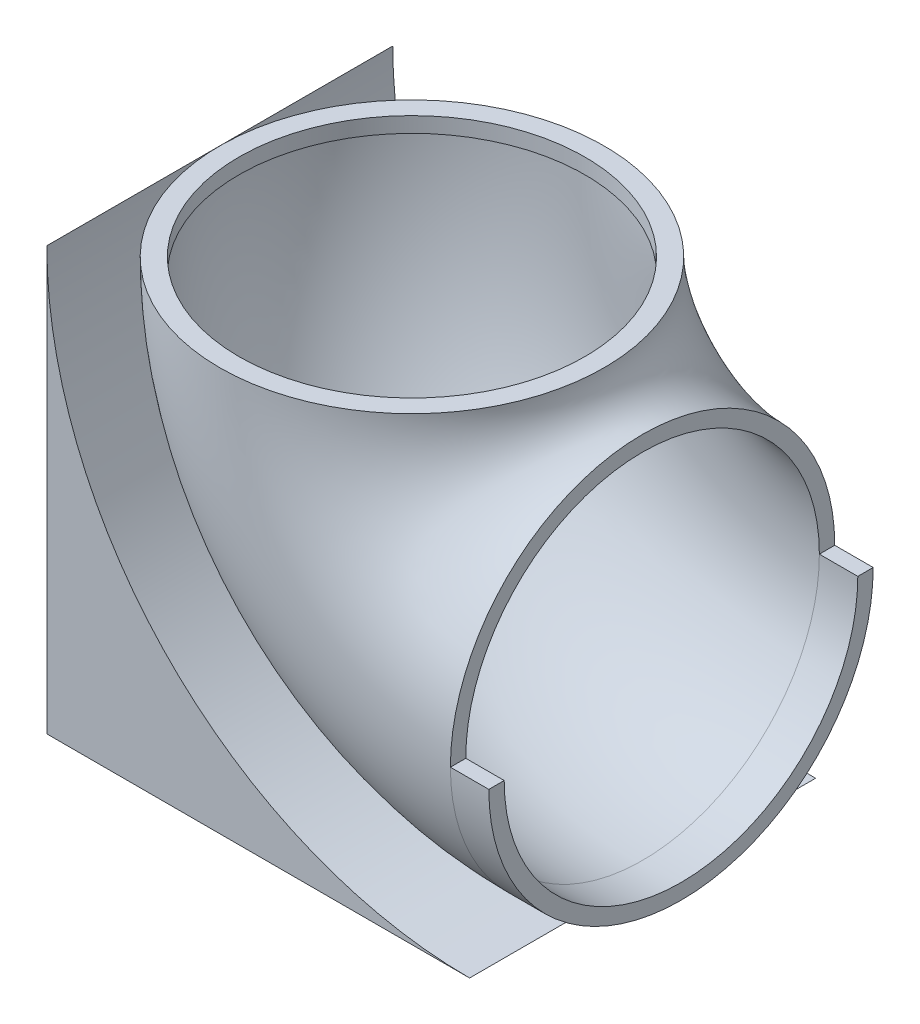
ISO-10303-21;
HEADER;
FILE_DESCRIPTION(('STEP AP214'),'2;1');
FILE_NAME('part.step','',(''),(''),'','','');
FILE_SCHEMA(('AUTOMOTIVE_DESIGN { 1 0 10303 214 1 1 1 1 }'));
ENDSEC;
DATA;
#1=APPLICATION_CONTEXT('core data for automotive mechanical design processes');
#2=APPLICATION_PROTOCOL_DEFINITION('international standard','automotive_design',2000,#1);
#3=PRODUCT_CONTEXT('',#1,'mechanical');
#4=PRODUCT('Part','Part','',(#3));
#5=PRODUCT_RELATED_PRODUCT_CATEGORY('part','',(#4));
#6=PRODUCT_DEFINITION_FORMATION('','',#4);
#7=PRODUCT_DEFINITION_CONTEXT('part definition',#1,'design');
#8=PRODUCT_DEFINITION('design','',#6,#7);
#9=PRODUCT_DEFINITION_SHAPE('','',#8);
#10=(LENGTH_UNIT() NAMED_UNIT(*) SI_UNIT(.MILLI.,.METRE.));
#11=(NAMED_UNIT(*) PLANE_ANGLE_UNIT() SI_UNIT($,.RADIAN.));
#12=(NAMED_UNIT(*) SI_UNIT($,.STERADIAN.) SOLID_ANGLE_UNIT());
#13=UNCERTAINTY_MEASURE_WITH_UNIT(LENGTH_MEASURE(1.E-05),#10,'distance_accuracy_value','');
#14=(GEOMETRIC_REPRESENTATION_CONTEXT(3) GLOBAL_UNCERTAINTY_ASSIGNED_CONTEXT((#13)) GLOBAL_UNIT_ASSIGNED_CONTEXT((#10,
#11,#12)) REPRESENTATION_CONTEXT('',''));
#15=CARTESIAN_POINT('',(0.,0.,0.));
#16=DIRECTION('',(0.,0.,1.));
#17=DIRECTION('',(1.,0.,0.));
#18=AXIS2_PLACEMENT_3D('',#15,#16,#17);
#19=CARTESIAN_POINT('',(0.,0.,22.5));
#20=DIRECTION('',(0.,0.,-1.));
#21=DIRECTION('',(-1.,0.,0.));
#22=AXIS2_PLACEMENT_3D('',#19,#20,#21);
#23=PLANE('',#22);
#24=CARTESIAN_POINT('',(30.0000000000001,0.,22.5));
#25=DIRECTION('',(0.,0.,-1.));
#26=DIRECTION('',(-1.,0.,0.));
#27=AXIS2_PLACEMENT_3D('',#24,#25,#26);
#28=CIRCLE('',#27,55.0000000000001);
#29=CARTESIAN_POINT('',(30.0000000000002,-55.,22.5));
#30=VERTEX_POINT('',#29);
#31=CARTESIAN_POINT('',(-25.,0.,22.5));
#32=VERTEX_POINT('',#31);
#33=EDGE_CURVE('E112',#30,#32,#28,.T.);
#34=ORIENTED_EDGE('',*,*,#33,.T.);
#35=DIRECTION('',(0.,-1.,0.));
#36=VECTOR('',#35,1.);
#37=CARTESIAN_POINT('',(-25.,0.,22.5));
#38=LINE('',#37,#36);
#39=CARTESIAN_POINT('',(-25.,-55.,22.5));
#40=VERTEX_POINT('',#39);
#41=EDGE_CURVE('E117',#32,#40,#38,.T.);
#42=ORIENTED_EDGE('',*,*,#41,.T.);
#43=DIRECTION('',(-1.,0.,0.));
#44=VECTOR('',#43,1.);
#45=CARTESIAN_POINT('',(30.0000000000002,-55.,22.5));
#46=LINE('',#45,#44);
#47=EDGE_CURVE('E92',#30,#40,#46,.T.);
#48=ORIENTED_EDGE('',*,*,#47,.F.);
#49=EDGE_LOOP('',(#34,#42,#48));
#50=FACE_BOUND('',#49,.T.);
#51=ADVANCED_FACE('F82',(#50),#23,.F.);
#52=CARTESIAN_POINT('',(0.,0.,-22.5));
#53=DIRECTION('',(0.,0.,-1.));
#54=DIRECTION('',(-1.,0.,0.));
#55=AXIS2_PLACEMENT_3D('',#52,#53,#54);
#56=PLANE('',#55);
#57=CARTESIAN_POINT('',(30.0000000000001,0.,-22.5));
#58=DIRECTION('',(0.,0.,-1.));
#59=DIRECTION('',(-1.,0.,0.));
#60=AXIS2_PLACEMENT_3D('',#57,#58,#59);
#61=CIRCLE('',#60,55.0000000000001);
#62=CARTESIAN_POINT('',(30.0000000000002,-55.,-22.5));
#63=VERTEX_POINT('',#62);
#64=CARTESIAN_POINT('',(-25.,0.,-22.5));
#65=VERTEX_POINT('',#64);
#66=EDGE_CURVE('E129',#63,#65,#61,.T.);
#67=ORIENTED_EDGE('',*,*,#66,.F.);
#68=DIRECTION('',(-1.,0.,0.));
#69=VECTOR('',#68,1.);
#70=CARTESIAN_POINT('',(30.0000000000002,-55.,-22.5));
#71=LINE('',#70,#69);
#72=CARTESIAN_POINT('',(-25.,-55.,-22.5));
#73=VERTEX_POINT('',#72);
#74=EDGE_CURVE('E13',#63,#73,#71,.T.);
#75=ORIENTED_EDGE('',*,*,#74,.T.);
#76=DIRECTION('',(0.,-1.,0.));
#77=VECTOR('',#76,1.);
#78=CARTESIAN_POINT('',(-25.,0.,-22.5));
#79=LINE('',#78,#77);
#80=EDGE_CURVE('E148',#65,#73,#79,.T.);
#81=ORIENTED_EDGE('',*,*,#80,.F.);
#82=EDGE_LOOP('',(#67,#75,#81));
#83=FACE_BOUND('',#82,.T.);
#84=ADVANCED_FACE('F168',(#83),#56,.T.);
#85=CARTESIAN_POINT('',(30.0000000000001,0.,-22.5));
#86=DIRECTION('',(0.,0.,1.));
#87=DIRECTION('',(1.,0.,0.));
#88=AXIS2_PLACEMENT_3D('',#85,#86,#87);
#89=CYLINDRICAL_SURFACE('',#88,55.0000000000001);
#90=ORIENTED_EDGE('',*,*,#33,.F.);
#91=DIRECTION('',(0.,0.,1.));
#92=VECTOR('',#91,1.);
#93=CARTESIAN_POINT('',(30.0000000000002,-55.,-22.5));
#94=LINE('',#93,#92);
#95=EDGE_CURVE('E124',#63,#30,#94,.T.);
#96=ORIENTED_EDGE('',*,*,#95,.F.);
#97=ORIENTED_EDGE('',*,*,#66,.T.);
#98=DIRECTION('',(0.,0.,1.));
#99=VECTOR('',#98,1.);
#100=CARTESIAN_POINT('',(-25.,0.,-22.5));
#101=LINE('',#100,#99);
#102=EDGE_CURVE('E133',#65,#32,#101,.T.);
#103=ORIENTED_EDGE('',*,*,#102,.T.);
#104=EDGE_LOOP('',(#90,#96,#97,#103));
#105=FACE_BOUND('',#104,.T.);
#106=ADVANCED_FACE('F131',(#105),#89,.F.);
#107=CARTESIAN_POINT('',(-25.,0.,-22.5));
#108=DIRECTION('',(-1.,0.,0.));
#109=DIRECTION('',(0.,0.,1.));
#110=AXIS2_PLACEMENT_3D('',#107,#108,#109);
#111=PLANE('',#110);
#112=ORIENTED_EDGE('',*,*,#41,.F.);
#113=ORIENTED_EDGE('',*,*,#102,.F.);
#114=ORIENTED_EDGE('',*,*,#80,.T.);
#115=DIRECTION('',(0.,0.,1.));
#116=VECTOR('',#115,1.);
#117=CARTESIAN_POINT('',(-25.,-55.,-22.5));
#118=LINE('',#117,#116);
#119=EDGE_CURVE('E121',#73,#40,#118,.T.);
#120=ORIENTED_EDGE('',*,*,#119,.T.);
#121=EDGE_LOOP('',(#112,#113,#114,#120));
#122=FACE_BOUND('',#121,.T.);
#123=ADVANCED_FACE('F167',(#122),#111,.T.);
#124=CARTESIAN_POINT('',(30.0000000000002,-55.,-22.5));
#125=DIRECTION('',(0.,1.,0.));
#126=DIRECTION('',(0.,0.,1.));
#127=AXIS2_PLACEMENT_3D('',#124,#125,#126);
#128=PLANE('',#127);
#129=CARTESIAN_POINT('',(-10.,-55.,15.));
#130=DIRECTION('',(0.,-1.,0.));
#131=DIRECTION('',(0.,0.,-1.));
#132=AXIS2_PLACEMENT_3D('',#129,#130,#131);
#133=CIRCLE('',#132,4.);
#134=CARTESIAN_POINT('',(-10.,-55.,11.));
#135=VERTEX_POINT('',#134);
#136=EDGE_CURVE('E139',#135,#135,#133,.T.);
#137=ORIENTED_EDGE('',*,*,#136,.F.);
#138=EDGE_LOOP('',(#137));
#139=FACE_BOUND('',#138,.T.);
#140=CARTESIAN_POINT('',(-10.,-55.,-15.));
#141=DIRECTION('',(0.,-1.,0.));
#142=DIRECTION('',(0.,0.,-1.));
#143=AXIS2_PLACEMENT_3D('',#140,#141,#142);
#144=CIRCLE('',#143,4.);
#145=CARTESIAN_POINT('',(-10.,-55.,-19.));
#146=VERTEX_POINT('',#145);
#147=EDGE_CURVE('E206',#146,#146,#144,.T.);
#148=ORIENTED_EDGE('',*,*,#147,.F.);
#149=EDGE_LOOP('',(#148));
#150=FACE_BOUND('',#149,.T.);
#151=ORIENTED_EDGE('',*,*,#47,.T.);
#152=ORIENTED_EDGE('',*,*,#119,.F.);
#153=ORIENTED_EDGE('',*,*,#74,.F.);
#154=ORIENTED_EDGE('',*,*,#95,.T.);
#155=EDGE_LOOP('',(#151,#152,#153,#154));
#156=FACE_BOUND('',#155,.T.);
#157=ADVANCED_FACE('F125',(#139,#150,#156),#128,.F.);
#158=CARTESIAN_POINT('',(-10.,-49.,-15.));
#159=DIRECTION('',(0.,-1.,0.));
#160=DIRECTION('',(0.,0.,-1.));
#161=AXIS2_PLACEMENT_3D('',#158,#159,#160);
#162=CYLINDRICAL_SURFACE('',#161,4.);
#163=CARTESIAN_POINT('',(-10.,-49.,-15.));
#164=DIRECTION('',(0.,-1.,0.));
#165=DIRECTION('',(0.,0.,-1.));
#166=AXIS2_PLACEMENT_3D('',#163,#164,#165);
#167=CIRCLE('',#166,4.);
#168=CARTESIAN_POINT('',(-10.,-49.,-19.));
#169=VERTEX_POINT('',#168);
#170=EDGE_CURVE('E210',#169,#169,#167,.T.);
#171=ORIENTED_EDGE('',*,*,#170,.F.);
#172=EDGE_LOOP('',(#171));
#173=FACE_BOUND('',#172,.T.);
#174=ORIENTED_EDGE('',*,*,#147,.T.);
#175=EDGE_LOOP('',(#174));
#176=FACE_BOUND('',#175,.T.);
#177=ADVANCED_FACE('F175',(#173,#176),#162,.F.);
#178=CARTESIAN_POINT('',(-10.,-49.,-15.));
#179=DIRECTION('',(0.,-1.,0.));
#180=DIRECTION('',(0.,0.,-1.));
#181=AXIS2_PLACEMENT_3D('',#178,#179,#180);
#182=PLANE('',#181);
#183=ORIENTED_EDGE('',*,*,#170,.T.);
#184=EDGE_LOOP('',(#183));
#185=FACE_BOUND('',#184,.T.);
#186=ADVANCED_FACE('F183',(#185),#182,.T.);
#187=CARTESIAN_POINT('',(-10.,-49.,15.));
#188=DIRECTION('',(0.,-1.,0.));
#189=DIRECTION('',(0.,0.,-1.));
#190=AXIS2_PLACEMENT_3D('',#187,#188,#189);
#191=CYLINDRICAL_SURFACE('',#190,4.);
#192=CARTESIAN_POINT('',(-10.,-49.,15.));
#193=DIRECTION('',(0.,-1.,0.));
#194=DIRECTION('',(0.,0.,-1.));
#195=AXIS2_PLACEMENT_3D('',#192,#193,#194);
#196=CIRCLE('',#195,4.);
#197=CARTESIAN_POINT('',(-10.,-49.,11.));
#198=VERTEX_POINT('',#197);
#199=EDGE_CURVE('E135',#198,#198,#196,.T.);
#200=ORIENTED_EDGE('',*,*,#199,.F.);
#201=EDGE_LOOP('',(#200));
#202=FACE_BOUND('',#201,.T.);
#203=ORIENTED_EDGE('',*,*,#136,.T.);
#204=EDGE_LOOP('',(#203));
#205=FACE_BOUND('',#204,.T.);
#206=ADVANCED_FACE('F191',(#202,#205),#191,.F.);
#207=CARTESIAN_POINT('',(-10.,-49.,15.));
#208=DIRECTION('',(0.,-1.,0.));
#209=DIRECTION('',(0.,0.,-1.));
#210=AXIS2_PLACEMENT_3D('',#207,#208,#209);
#211=PLANE('',#210);
#212=ORIENTED_EDGE('',*,*,#199,.T.);
#213=EDGE_LOOP('',(#212));
#214=FACE_BOUND('',#213,.T.);
#215=ADVANCED_FACE('F196',(#214),#211,.T.);
#216=CLOSED_SHELL('',(#51,#84,#106,#123,#157,#177,#186,#206,#215));
#217=MANIFOLD_SOLID_BREP('B2',#216);
#218=CARTESIAN_POINT('',(0.,85.,0.));
#219=DIRECTION('',(0.,-1.,0.));
#220=DIRECTION('',(0.,0.,-1.));
#221=AXIS2_PLACEMENT_3D('',#218,#219,#220);
#222=CYLINDRICAL_SURFACE('',#221,22.5);
#223=CARTESIAN_POINT('',(0.,-2.,0.));
#224=DIRECTION('',(0.,1.,0.));
#225=DIRECTION('',(0.,0.,1.));
#226=AXIS2_PLACEMENT_3D('',#223,#224,#225);
#227=CIRCLE('',#226,22.5);
#228=CARTESIAN_POINT('',(0.,-2.,22.5));
#229=VERTEX_POINT('',#228);
#230=EDGE_CURVE('E353',#229,#229,#227,.T.);
#231=ORIENTED_EDGE('',*,*,#230,.F.);
#232=EDGE_LOOP('',(#231));
#233=FACE_BOUND('',#232,.T.);
#234=CARTESIAN_POINT('',(0.,0.,0.));
#235=DIRECTION('',(0.,1.,0.));
#236=DIRECTION('',(0.,0.,1.));
#237=AXIS2_PLACEMENT_3D('',#234,#235,#236);
#238=CIRCLE('',#237,22.5);
#239=CARTESIAN_POINT('',(0.,0.,22.5));
#240=VERTEX_POINT('',#239);
#241=EDGE_CURVE('E391',#240,#240,#238,.T.);
#242=ORIENTED_EDGE('',*,*,#241,.T.);
#243=EDGE_LOOP('',(#242));
#244=FACE_BOUND('',#243,.T.);
#245=ADVANCED_FACE('F271',(#233,#244),#222,.F.);
#246=CARTESIAN_POINT('',(30.,0.,0.));
#247=DIRECTION('',(0.,0.,-1.));
#248=DIRECTION('',(-1.,0.,0.));
#249=AXIS2_PLACEMENT_3D('',#246,#247,#248);
#250=TOROIDAL_SURFACE('',#249,30.,25.);
#251=CARTESIAN_POINT('',(30.0000000000001,-30.,0.));
#252=DIRECTION('',(1.,0.,0.));
#253=DIRECTION('',(0.,1.,0.));
#254=AXIS2_PLACEMENT_3D('',#251,#252,#253);
#255=CIRCLE('',#254,25.);
#256=CARTESIAN_POINT('',(30.0000000000001,-30.,25.));
#257=VERTEX_POINT('',#256);
#258=CARTESIAN_POINT('',(30.0000000000001,-30.,-25.));
#259=VERTEX_POINT('',#258);
#260=EDGE_CURVE('E329',#257,#259,#255,.T.);
#261=ORIENTED_EDGE('',*,*,#260,.F.);
#262=CARTESIAN_POINT('',(30.0000000000001,-30.,0.));
#263=DIRECTION('',(-1.,0.,0.));
#264=DIRECTION('',(0.,-1.,0.));
#265=AXIS2_PLACEMENT_3D('',#262,#263,#264);
#266=CIRCLE('',#265,25.);
#267=EDGE_CURVE('E307',#257,#259,#266,.T.);
#268=ORIENTED_EDGE('',*,*,#267,.T.);
#269=EDGE_LOOP('',(#261,#268));
#270=FACE_BOUND('',#269,.T.);
#271=CARTESIAN_POINT('',(0.,0.,0.));
#272=DIRECTION('',(0.,1.,0.));
#273=DIRECTION('',(0.,0.,1.));
#274=AXIS2_PLACEMENT_3D('',#271,#272,#273);
#275=CIRCLE('',#274,25.);
#276=CARTESIAN_POINT('',(0.,0.,25.));
#277=VERTEX_POINT('',#276);
#278=EDGE_CURVE('E392',#277,#277,#275,.F.);
#279=ORIENTED_EDGE('',*,*,#278,.T.);
#280=EDGE_LOOP('',(#279));
#281=FACE_BOUND('',#280,.T.);
#282=ADVANCED_FACE('F333',(#270,#281),#250,.T.);
#283=CARTESIAN_POINT('',(35.0000000000001,-30.,0.));
#284=DIRECTION('',(-1.,0.,0.));
#285=DIRECTION('',(0.,-1.,0.));
#286=AXIS2_PLACEMENT_3D('',#283,#284,#285);
#287=CYLINDRICAL_SURFACE('',#286,25.);
#288=CARTESIAN_POINT('',(35.0000000000001,-30.,0.));
#289=DIRECTION('',(1.,0.,0.));
#290=DIRECTION('',(0.,1.,0.));
#291=AXIS2_PLACEMENT_3D('',#288,#289,#290);
#292=CIRCLE('',#291,25.);
#293=CARTESIAN_POINT('',(35.0000000000001,-30.,25.));
#294=VERTEX_POINT('',#293);
#295=CARTESIAN_POINT('',(35.0000000000001,-30.,-25.));
#296=VERTEX_POINT('',#295);
#297=EDGE_CURVE('E331',#294,#296,#292,.T.);
#298=ORIENTED_EDGE('',*,*,#297,.F.);
#299=DIRECTION('',(1.,0.,0.));
#300=VECTOR('',#299,1.);
#301=CARTESIAN_POINT('',(30.0000000000001,-30.,25.));
#302=LINE('',#301,#300);
#303=EDGE_CURVE('E320',#257,#294,#302,.T.);
#304=ORIENTED_EDGE('',*,*,#303,.F.);
#305=ORIENTED_EDGE('',*,*,#260,.T.);
#306=DIRECTION('',(1.,0.,0.));
#307=VECTOR('',#306,1.);
#308=CARTESIAN_POINT('',(30.0000000000001,-30.,-25.));
#309=LINE('',#308,#307);
#310=EDGE_CURVE('E315',#259,#296,#309,.T.);
#311=ORIENTED_EDGE('',*,*,#310,.T.);
#312=EDGE_LOOP('',(#298,#304,#305,#311));
#313=FACE_BOUND('',#312,.T.);
#314=ADVANCED_FACE('F327',(#313),#287,.T.);
#315=CARTESIAN_POINT('',(35.0000000000001,-30.,0.));
#316=DIRECTION('',(1.,0.,0.));
#317=DIRECTION('',(0.,1.,0.));
#318=AXIS2_PLACEMENT_3D('',#315,#316,#317);
#319=PLANE('',#318);
#320=DIRECTION('',(0.,0.,-1.));
#321=VECTOR('',#320,1.);
#322=CARTESIAN_POINT('',(35.0000000000001,-30.,25.));
#323=LINE('',#322,#321);
#324=CARTESIAN_POINT('',(35.0000000000001,-30.,23.));
#325=VERTEX_POINT('',#324);
#326=EDGE_CURVE('E352',#294,#325,#323,.T.);
#327=ORIENTED_EDGE('',*,*,#326,.F.);
#328=ORIENTED_EDGE('',*,*,#297,.T.);
#329=CARTESIAN_POINT('',(35.0000000000001,-30.,-23.));
#330=VERTEX_POINT('',#329);
#331=EDGE_CURVE('E345',#330,#296,#323,.T.);
#332=ORIENTED_EDGE('',*,*,#331,.F.);
#333=CARTESIAN_POINT('',(35.0000000000001,-30.,0.));
#334=DIRECTION('',(1.,0.,0.));
#335=DIRECTION('',(0.,1.,0.));
#336=AXIS2_PLACEMENT_3D('',#333,#334,#335);
#337=CIRCLE('',#336,23.);
#338=EDGE_CURVE('E339',#325,#330,#337,.T.);
#339=ORIENTED_EDGE('',*,*,#338,.F.);
#340=EDGE_LOOP('',(#327,#328,#332,#339));
#341=FACE_BOUND('',#340,.T.);
#342=ADVANCED_FACE('F351',(#341),#319,.T.);
#343=CARTESIAN_POINT('',(30.,0.,0.));
#344=DIRECTION('',(0.,0.,-1.));
#345=DIRECTION('',(-1.,0.,0.));
#346=AXIS2_PLACEMENT_3D('',#343,#344,#345);
#347=TOROIDAL_SURFACE('',#346,30.,23.);
#348=CARTESIAN_POINT('',(30.0000000000001,-30.,0.));
#349=DIRECTION('',(-1.,0.,0.));
#350=DIRECTION('',(0.,-1.,0.));
#351=AXIS2_PLACEMENT_3D('',#348,#349,#350);
#352=CIRCLE('',#351,23.);
#353=CARTESIAN_POINT('',(30.0000000000001,-30.,-23.));
#354=VERTEX_POINT('',#353);
#355=CARTESIAN_POINT('',(30.0000000000001,-30.,23.));
#356=VERTEX_POINT('',#355);
#357=EDGE_CURVE('E289',#354,#356,#352,.F.);
#358=ORIENTED_EDGE('',*,*,#357,.T.);
#359=EDGE_CURVE('E314',#356,#354,#352,.F.);
#360=ORIENTED_EDGE('',*,*,#359,.T.);
#361=EDGE_LOOP('',(#358,#360));
#362=FACE_BOUND('',#361,.T.);
#363=CARTESIAN_POINT('',(-16.1521800609827,-2.,-16.3311344858411));
#364=CARTESIAN_POINT('',(-15.6926575254816,-2.,-16.7864193980092));
#365=CARTESIAN_POINT('',(-15.213968669036,-2.,-17.2222546662401));
#366=CARTESIAN_POINT('',(-14.2214193138179,-2.,-18.0521918617121));
#367=CARTESIAN_POINT('',(-13.7075494564307,-2.,-18.4462826127835));
#368=CARTESIAN_POINT('',(-12.6478514648188,-2.,-19.1901855512612));
#369=CARTESIAN_POINT('',(-12.1019881106165,-2.,-19.5399475477929));
#370=CARTESIAN_POINT('',(-10.9827539200928,-2.,-20.1921863736468));
#371=CARTESIAN_POINT('',(-10.4093849401818,-2.,-20.4946663882742));
#372=CARTESIAN_POINT('',(-9.23949888869036,-2.,-21.0500886829596));
#373=CARTESIAN_POINT('',(-8.64299388201044,-2.,-21.3030563772269));
#374=CARTESIAN_POINT('',(-7.43079481547017,-2.,-21.7578764219807));
#375=CARTESIAN_POINT('',(-6.81510045381304,-2.,-21.959727968092));
#376=CARTESIAN_POINT('',(-5.56907365480272,-2.,-22.310856956331));
#377=CARTESIAN_POINT('',(-4.93874509498806,-2.,-22.4601481593653));
#378=CARTESIAN_POINT('',(-3.6677703630087,-2.,-22.7052020603749));
#379=CARTESIAN_POINT('',(-3.02712422184022,-2.,-22.80096491913));
#380=CARTESIAN_POINT('',(-1.73923523342294,-2.,-22.9384078396291));
#381=CARTESIAN_POINT('',(-1.09198505176568,-2.,-22.9800191722588));
#382=CARTESIAN_POINT('',(0.203721546881954,-2.,-23.0086816011404));
#383=CARTESIAN_POINT('',(0.852177965436526,-2.,-22.9957326265915));
#384=CARTESIAN_POINT('',(2.14574403765465,-2.,-22.9154127847956));
#385=CARTESIAN_POINT('',(2.79085351614781,-2.,-22.8480390974455));
#386=CARTESIAN_POINT('',(4.07314309619693,-2.,-22.6593984639075));
#387=CARTESIAN_POINT('',(4.71032318272901,-2.,-22.5381314156235));
#388=CARTESIAN_POINT('',(5.9740743629958,-2.,-22.2422012808867));
#389=CARTESIAN_POINT('',(6.6006100921216,-2.,-22.0673871728954));
#390=CARTESIAN_POINT('',(7.83679631730266,-2.,-21.6657898134567));
#391=CARTESIAN_POINT('',(8.44644679249724,-2.,-21.4390064978077));
#392=CARTESIAN_POINT('',(9.64458488843265,-2.,-20.9351534558422));
#393=CARTESIAN_POINT('',(10.2330729166768,-2.,-20.6580846984422));
#394=CARTESIAN_POINT('',(11.3848067532069,-2.,-20.0556891263433));
#395=CARTESIAN_POINT('',(11.9480524710712,-2.,-19.7303621387943));
#396=CARTESIAN_POINT('',(13.0481935102415,-2.,-19.0320471424553));
#397=CARTESIAN_POINT('',(13.5849408057043,-2.,-18.6588259223683));
#398=CARTESIAN_POINT('',(14.6252851588449,-2.,-17.8687383319873));
#399=CARTESIAN_POINT('',(15.1288821020005,-2.,-17.4518718109278));
#400=CARTESIAN_POINT('',(16.0995165014533,-2.,-16.577434194432));
#401=CARTESIAN_POINT('',(16.5665495667199,-2.,-16.1198582241686));
#402=CARTESIAN_POINT('',(17.4607594053644,-2.,-15.1673202270641));
#403=CARTESIAN_POINT('',(17.8879359468592,-2.,-14.6723579827418));
#404=CARTESIAN_POINT('',(18.7023863145778,-2.,-13.6448096288823));
#405=CARTESIAN_POINT('',(19.0893573882524,-2.,-13.1119827340714));
#406=CARTESIAN_POINT('',(19.6350393901427,-2.,-12.2899102491123));
#407=CARTESIAN_POINT('',(19.8111453749308,-2.,-12.012066601675));
#408=CARTESIAN_POINT('',(20.1515277307385,-2.,-11.4491204648222));
#409=CARTESIAN_POINT('',(20.3158008923244,-2.,-11.1640160342242));
#410=CARTESIAN_POINT('',(20.7902696333907,-2.,-10.2987141520804));
#411=CARTESIAN_POINT('',(21.0822125995843,-2.,-9.70838029140693));
#412=CARTESIAN_POINT('',(21.6147716228901,-2.,-8.50499702131085));
#413=CARTESIAN_POINT('',(21.855389172049,-2.,-7.89194827282576));
#414=CARTESIAN_POINT('',(22.175655118788,-2.,-6.95983997765273));
#415=CARTESIAN_POINT('',(22.2754950941204,-2.,-6.64760221958503));
#416=CARTESIAN_POINT('',(22.4615752123163,-2.,-6.01918966454013));
#417=CARTESIAN_POINT('',(22.547818830936,-2.,-5.70301589613211));
#418=CARTESIAN_POINT('',(22.7858033981648,-2.,-4.74925681688985));
#419=CARTESIAN_POINT('',(22.916822930735,-2.,-4.10636145040781));
#420=CARTESIAN_POINT('',(23.1216581394896,-2.,-2.8119308154001));
#421=CARTESIAN_POINT('',(23.1955031162419,-2.,-2.16040014661843));
#422=CARTESIAN_POINT('',(23.2849916995733,-2.,-0.85334090478862));
#423=CARTESIAN_POINT('',(23.3006378093596,-2.,-0.197812504902748));
#424=CARTESIAN_POINT('',(23.274021388634,-2.,1.08562440319145));
#425=CARTESIAN_POINT('',(23.2340655218374,-2.,1.71358208706634));
#426=CARTESIAN_POINT('',(23.1009202111351,-2.,2.96379224834695));
#427=CARTESIAN_POINT('',(23.0077316249073,-2.,3.58604481750854));
#428=CARTESIAN_POINT('',(22.7693144117282,-2.,4.82075351444813));
#429=CARTESIAN_POINT('',(22.6240700341903,-2.,5.43320661853546));
#430=CARTESIAN_POINT('',(22.3685302313426,-2.,6.34107544319904));
#431=CARTESIAN_POINT('',(22.277065058318,-2.,6.64191362944558));
#432=CARTESIAN_POINT('',(22.0817807642377,-2.,7.23963374172556));
#433=CARTESIAN_POINT('',(21.9779587431334,-2.,7.53651472078432));
#434=CARTESIAN_POINT('',(21.6480078898674,-2.,8.42129893184051));
#435=CARTESIAN_POINT('',(21.4036322582824,-2.,9.0024997017709));
#436=CARTESIAN_POINT('',(20.8684120551748,-2.,10.1430955757506));
#437=CARTESIAN_POINT('',(20.5775664262623,-2.,10.7024901832566));
#438=CARTESIAN_POINT('',(20.1081575323736,-2.,11.5225008886526));
#439=CARTESIAN_POINT('',(19.9461359663171,-2.,11.7926992207045));
#440=CARTESIAN_POINT('',(19.6113581918716,-2.,12.3262670918269));
#441=CARTESIAN_POINT('',(19.438604657412,-2.,12.5896383089174));
#442=CARTESIAN_POINT('',(18.90457898242,-2.,13.3690313712884));
#443=CARTESIAN_POINT('',(18.5275243416873,-2.,13.8743630573373));
#444=CARTESIAN_POINT('',(17.7182637156236,-2.,14.8723732273397));
#445=CARTESIAN_POINT('',(17.2844645497111,-2.,15.3637572254849));
#446=CARTESIAN_POINT('',(16.3772222154077,-2.,16.308499853078));
#447=CARTESIAN_POINT('',(15.9037780475323,-2.,16.7618575232725));
#448=CARTESIAN_POINT('',(14.9205181931885,-2.,17.6272929111927));
#449=CARTESIAN_POINT('',(14.410700864263,-2.,18.0393687627847));
#450=CARTESIAN_POINT('',(13.3582493665743,-2.,18.8192331657889));
#451=CARTESIAN_POINT('',(12.8156153525256,-2.,19.1870219259683));
#452=CARTESIAN_POINT('',(11.6987946249169,-2.,19.8771759093526));
#453=CARTESIAN_POINT('',(11.1244765231026,-2.,20.1993285669752));
#454=CARTESIAN_POINT('',(9.95060924206719,-2.,20.7938276774854));
#455=CARTESIAN_POINT('',(9.35105990885838,-2.,21.0661738263468));
#456=CARTESIAN_POINT('',(8.13101425408906,-2.,21.5590071777136));
#457=CARTESIAN_POINT('',(7.51051804810055,-2.,21.7794946662897));
#458=CARTESIAN_POINT('',(6.25303253341804,-2.,22.1669364885114));
#459=CARTESIAN_POINT('',(5.61604333503424,-2.,22.3338911801007));
#460=CARTESIAN_POINT('',(4.33460010227464,-2.,22.6120235341551));
#461=CARTESIAN_POINT('',(3.69022774050706,-2.,22.7235775768776));
#462=CARTESIAN_POINT('',(2.39435413164893,-2.,22.8917608139302));
#463=CARTESIAN_POINT('',(1.74285291167736,-2.,22.9483902171262));
#464=CARTESIAN_POINT('',(0.4374122221025,-2.,23.0062608346488));
#465=CARTESIAN_POINT('',(-0.216527179834112,-2.,23.0075035748415));
#466=CARTESIAN_POINT('',(-1.52215773494206,-2.,22.9545470669805));
#467=CARTESIAN_POINT('',(-2.17384889436919,-2.,22.9003479733204));
#468=CARTESIAN_POINT('',(-3.46692359629845,-2.,22.7372812533409));
#469=CARTESIAN_POINT('',(-4.10834304497831,-2.,22.6286982512655));
#470=CARTESIAN_POINT('',(-5.37971986504905,-2.,22.3577503644255));
#471=CARTESIAN_POINT('',(-6.00967727697051,-2.,22.1953856698757));
#472=CARTESIAN_POINT('',(-7.25361210238697,-2.,21.8180080771643));
#473=CARTESIAN_POINT('',(-7.86758971152939,-2.,21.6029958239247));
#474=CARTESIAN_POINT('',(-9.07517065444511,-2.,21.1218360648219));
#475=CARTESIAN_POINT('',(-9.66877401256356,-2.,20.8556886200627));
#476=CARTESIAN_POINT('',(-10.829654366344,-2.,20.2749907292944));
#477=CARTESIAN_POINT('',(-11.3970028744203,-2.,19.9605832355885));
#478=CARTESIAN_POINT('',(-12.50315510718,-2.,19.2850295821032));
#479=CARTESIAN_POINT('',(-13.0419588910842,-2.,18.9238835192962));
#480=CARTESIAN_POINT('',(-14.0871680276657,-2.,18.1574163861177));
#481=CARTESIAN_POINT('',(-14.5935735623875,-2.,17.7520955639971));
#482=CARTESIAN_POINT('',(-15.5703677404151,-2.,16.9001580905109));
#483=CARTESIAN_POINT('',(-16.040756405545,-2.,16.4535414641685));
#484=CARTESIAN_POINT('',(-16.9414398208475,-2.,15.5229267266313));
#485=CARTESIAN_POINT('',(-17.3717966113448,-2.,15.0389886587023));
#486=CARTESIAN_POINT('',(-18.1901804079075,-2.,14.0365548552536));
#487=CARTESIAN_POINT('',(-18.5782074620006,-2.,13.5180591589441));
#488=CARTESIAN_POINT('',(-19.3091615164887,-2.,12.4501978292283));
#489=CARTESIAN_POINT('',(-19.6520885918447,-2.,11.9008322471333));
#490=CARTESIAN_POINT('',(-20.2903948142374,-2.,10.7751396299389));
#491=CARTESIAN_POINT('',(-20.5857739770919,-2.,10.1988126038089));
#492=CARTESIAN_POINT('',(-21.1266523269663,-2.,9.02378400590773));
#493=CARTESIAN_POINT('',(-21.3721923011671,-2.,8.42510120854565));
#494=CARTESIAN_POINT('',(-21.8119453210343,-2.,7.20917270180321));
#495=CARTESIAN_POINT('',(-22.0061583882924,-2.,6.59192700023179));
#496=CARTESIAN_POINT('',(-22.3418654386283,-2.,5.34328929414631));
#497=CARTESIAN_POINT('',(-22.4833616007508,-2.,4.71189787548709));
#498=CARTESIAN_POINT('',(-22.7126367849094,-2.,3.43943674473733));
#499=CARTESIAN_POINT('',(-22.800415868668,-2.,2.79836704376829));
#500=CARTESIAN_POINT('',(-22.9216002073231,-2.,1.51143757080273));
#501=CARTESIAN_POINT('',(-22.955033053605,-2.,0.865580396810736));
#502=CARTESIAN_POINT('',(-22.9673727585874,-2.,-0.426657004303744));
#503=CARTESIAN_POINT('',(-22.946279419517,-2.,-1.0730372333149));
#504=CARTESIAN_POINT('',(-22.8497041834717,-2.,-2.36188835981571));
#505=CARTESIAN_POINT('',(-22.7742083636222,-2.,-3.00435821409404));
#506=CARTESIAN_POINT('',(-22.56935276602,-2.,-4.28064150050898));
#507=CARTESIAN_POINT('',(-22.4399938450597,-2.,-4.91445507017423));
#508=CARTESIAN_POINT('',(-22.1282764603488,-2.,-6.16916037068424));
#509=CARTESIAN_POINT('',(-21.9458985591163,-2.,-6.79004727281584));
#510=CARTESIAN_POINT('',(-21.5294508477414,-2.,-8.01427988395138));
#511=CARTESIAN_POINT('',(-21.2953775817586,-2.,-8.61762441719326));
#512=CARTESIAN_POINT('',(-20.7774967690291,-2.,-9.80178604301557));
#513=CARTESIAN_POINT('',(-20.4937449810371,-2.,-10.382627509511));
#514=CARTESIAN_POINT('',(-19.8784623744136,-2.,-11.5181825073866));
#515=CARTESIAN_POINT('',(-19.546944243503,-2.,-12.0729029253016));
#516=CARTESIAN_POINT('',(-18.7526122293567,-2.,-13.2831671053083));
#517=CARTESIAN_POINT('',(-18.2774360456031,-2.,-13.9306450908125));
#518=CARTESIAN_POINT('',(-17.2620516555368,-2.,-15.1724237457622));
#519=CARTESIAN_POINT('',(-16.7218434504741,-2.,-15.76672441623));
#520=CARTESIAN_POINT('',(-16.1521800609827,-2.,-16.3311344858411));
#521=B_SPLINE_CURVE_WITH_KNOTS('',3,(#363,#364,#365,#366,#367,#368,#369,#370,#371,#372,#373,
#374,#375,#376,#377,#378,#379,#380,#381,#382,#383,#384,#385,#386,#387,#388,#389,#390,#391,#392,
#393,#394,#395,#396,#397,#398,#399,#400,#401,#402,#403,#404,#405,#406,#407,#408,#409,#410,#411,
#412,#413,#414,#415,#416,#417,#418,#419,#420,#421,#422,#423,#424,#425,#426,#427,#428,#429,#430,
#431,#432,#433,#434,#435,#436,#437,#438,#439,#440,#441,#442,#443,#444,#445,#446,#447,#448,#449,
#450,#451,#452,#453,#454,#455,#456,#457,#458,#459,#460,#461,#462,#463,#464,#465,#466,#467,#468,
#469,#470,#471,#472,#473,#474,#475,#476,#477,#478,#479,#480,#481,#482,#483,#484,#485,#486,#487,
#488,#489,#490,#491,#492,#493,#494,#495,#496,#497,#498,#499,#500,#501,#502,#503,#504,#505,#506,
#507,#508,#509,#510,#511,#512,#513,#514,#515,#516,#517,#518,#519,#520),.UNSPECIFIED.,.T.,.F.,(4,
2,2,2,2,2,2,2,2,2,2,2,2,2,2,2,2,2,2,2,2,2,2,2,2,2,2,2,2,2,2,2,2,2,2,2,2,2,2,2,2,2,2,2,2,2,2,2,2,
2,2,2,2,2,2,2,2,2,2,2,2,2,2,2,2,2,2,2,2,2,2,2,2,2,2,2,2,2,4),(0.,1.93991839425366,
3.88035485291781,5.82296909189847,7.76545240386777,9.70693602743569,11.6484502007265,
13.5894556844593,15.5304553380846,17.473916113453,19.4173794107803,21.3609434182151,
23.3045111075702,25.2536116155399,27.2027145313943,29.151779895276,31.1008522404421,
33.0598034131403,35.0187613529353,36.9779541882633,38.9371584213613,40.9101838602588,
41.8967929639434,42.8836686671805,44.8568895332225,46.8300530292678,47.8132187803079,
48.7961327870658,50.7617322537763,52.7263237306426,54.6908307069543,56.5762250577013,
58.4615890321014,60.34752394572,61.2906002624067,62.2338983492613,64.1231163498011,
66.0123773442021,66.9573097385098,67.9020076346711,69.7912985354554,71.7554404296768,
73.7196318565116,75.6839120340697,77.6481829517354,79.6213217811544,81.5944726545013,
83.5676126429897,85.5407394379203,87.5002713074419,89.4597957252785,91.4192661594776,
93.3787311369925,95.3280465488011,97.2773550663529,99.2266397064659,101.175922017302,
103.119537933836,105.063149817854,107.006750779832,108.950350564094,110.890886195384,
112.831419624908,114.771949829014,116.712479387556,118.651414403453,120.5903486037,
122.529202649526,124.468054467548,126.405921629823,128.343795820908,130.2821661358,
132.220505618498,134.159556621009,136.098737288534,138.03575522841,139.972259601852,
142.377148206164,144.782036764246),.UNSPECIFIED.);
#522=CARTESIAN_POINT('',(-16.1521800609827,-2.,-16.3311344858411));
#523=VERTEX_POINT('',#522);
#524=EDGE_CURVE('E335',#523,#523,#521,.T.);
#525=ORIENTED_EDGE('',*,*,#524,.F.);
#526=EDGE_LOOP('',(#525));
#527=FACE_BOUND('',#526,.T.);
#528=ADVANCED_FACE('F363',(#362,#527),#347,.F.);
#529=CARTESIAN_POINT('',(0.,-2.,0.));
#530=DIRECTION('',(0.,1.,0.));
#531=DIRECTION('',(0.,0.,1.));
#532=AXIS2_PLACEMENT_3D('',#529,#530,#531);
#533=PLANE('',#532);
#534=ORIENTED_EDGE('',*,*,#230,.T.);
#535=EDGE_LOOP('',(#534));
#536=FACE_BOUND('',#535,.T.);
#537=ORIENTED_EDGE('',*,*,#524,.T.);
#538=EDGE_LOOP('',(#537));
#539=FACE_BOUND('',#538,.T.);
#540=ADVANCED_FACE('F366',(#536,#539),#533,.F.);
#541=CARTESIAN_POINT('',(35.0000000000001,-30.,0.));
#542=DIRECTION('',(-1.,0.,0.));
#543=DIRECTION('',(0.,-1.,0.));
#544=AXIS2_PLACEMENT_3D('',#541,#542,#543);
#545=CYLINDRICAL_SURFACE('',#544,23.);
#546=DIRECTION('',(-1.,0.,0.));
#547=VECTOR('',#546,1.);
#548=CARTESIAN_POINT('',(35.0000000000001,-30.,23.));
#549=LINE('',#548,#547);
#550=EDGE_CURVE('E80',#325,#356,#549,.T.);
#551=ORIENTED_EDGE('',*,*,#550,.F.);
#552=ORIENTED_EDGE('',*,*,#338,.T.);
#553=DIRECTION('',(-1.,0.,0.));
#554=VECTOR('',#553,1.);
#555=CARTESIAN_POINT('',(35.0000000000001,-30.,-23.));
#556=LINE('',#555,#554);
#557=EDGE_CURVE('E278',#354,#330,#556,.F.);
#558=ORIENTED_EDGE('',*,*,#557,.F.);
#559=ORIENTED_EDGE('',*,*,#359,.F.);
#560=EDGE_LOOP('',(#551,#552,#558,#559));
#561=FACE_BOUND('',#560,.T.);
#562=ADVANCED_FACE('F355',(#561),#545,.F.);
#563=CARTESIAN_POINT('',(30.0000000000001,-30.,25.));
#564=DIRECTION('',(0.,-1.,0.));
#565=DIRECTION('',(1.,0.,0.));
#566=AXIS2_PLACEMENT_3D('',#563,#564,#565);
#567=PLANE('',#566);
#568=ORIENTED_EDGE('',*,*,#550,.T.);
#569=DIRECTION('',(0.,0.,-1.));
#570=VECTOR('',#569,1.);
#571=CARTESIAN_POINT('',(30.0000000000001,-30.,25.));
#572=LINE('',#571,#570);
#573=EDGE_CURVE('E285',#257,#356,#572,.T.);
#574=ORIENTED_EDGE('',*,*,#573,.F.);
#575=ORIENTED_EDGE('',*,*,#303,.T.);
#576=ORIENTED_EDGE('',*,*,#326,.T.);
#577=EDGE_LOOP('',(#568,#574,#575,#576));
#578=FACE_BOUND('',#577,.T.);
#579=ADVANCED_FACE('F319',(#578),#567,.F.);
#580=CARTESIAN_POINT('',(30.0000000000001,-24.6114857463779,0.));
#581=DIRECTION('',(-1.,0.,0.));
#582=DIRECTION('',(0.,-1.,0.));
#583=AXIS2_PLACEMENT_3D('',#580,#581,#582);
#584=PLANE('',#583);
#585=ORIENTED_EDGE('',*,*,#573,.T.);
#586=ORIENTED_EDGE('',*,*,#357,.F.);
#587=EDGE_CURVE('E309',#354,#259,#572,.T.);
#588=ORIENTED_EDGE('',*,*,#587,.T.);
#589=ORIENTED_EDGE('',*,*,#267,.F.);
#590=EDGE_LOOP('',(#585,#586,#588,#589));
#591=FACE_BOUND('',#590,.T.);
#592=ADVANCED_FACE('F308',(#591),#584,.F.);
#593=ORIENTED_EDGE('',*,*,#557,.T.);
#594=ORIENTED_EDGE('',*,*,#331,.T.);
#595=ORIENTED_EDGE('',*,*,#310,.F.);
#596=ORIENTED_EDGE('',*,*,#587,.F.);
#597=EDGE_LOOP('',(#593,#594,#595,#596));
#598=FACE_BOUND('',#597,.T.);
#599=ADVANCED_FACE('F344',(#598),#567,.F.);
#600=CARTESIAN_POINT('',(0.,0.,0.));
#601=DIRECTION('',(0.,1.,0.));
#602=DIRECTION('',(0.,0.,1.));
#603=AXIS2_PLACEMENT_3D('',#600,#601,#602);
#604=PLANE('',#603);
#605=ORIENTED_EDGE('',*,*,#241,.F.);
#606=EDGE_LOOP('',(#605));
#607=FACE_BOUND('',#606,.T.);
#608=ORIENTED_EDGE('',*,*,#278,.F.);
#609=EDGE_LOOP('',(#608));
#610=FACE_BOUND('',#609,.T.);
#611=ADVANCED_FACE('F373',(#607,#610),#604,.T.);
#612=CLOSED_SHELL('',(#245,#282,#314,#342,#528,#540,#562,#579,#592,#599,#611));
#613=MANIFOLD_SOLID_BREP('B7',#612);
#614=ADVANCED_BREP_SHAPE_REPRESENTATION('',(#18,#217,#613),#14);
#615=SHAPE_DEFINITION_REPRESENTATION(#9,#614);
ENDSEC;
END-ISO-10303-21;
